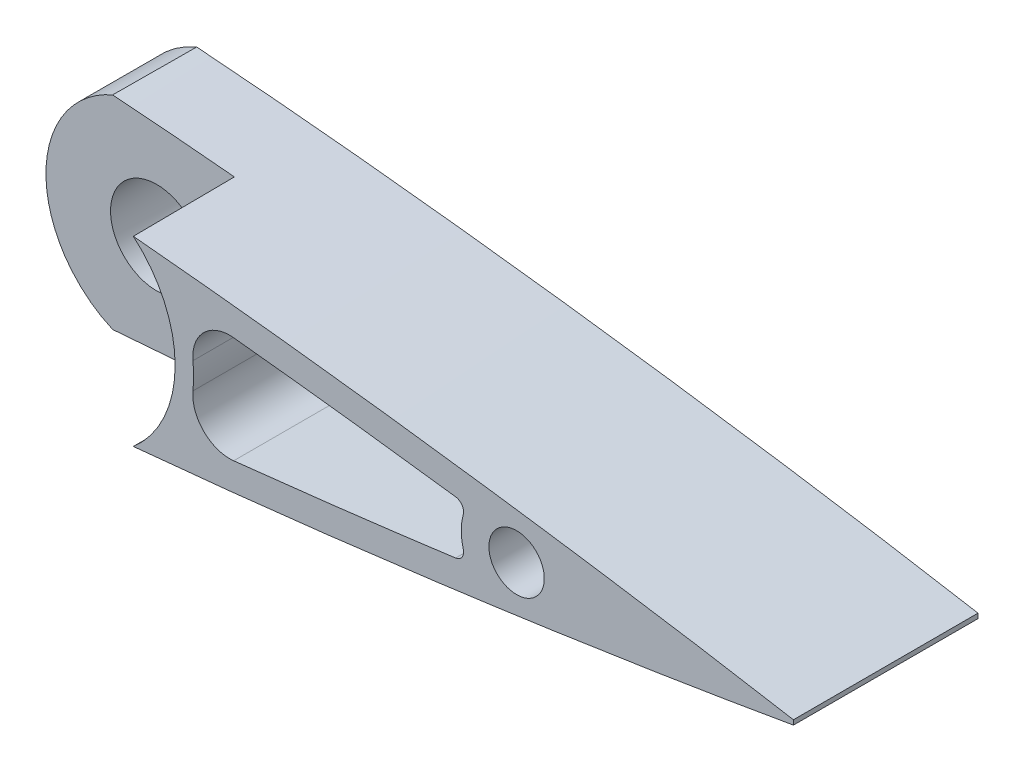
ISO-10303-21;
HEADER;
FILE_DESCRIPTION(('STEP AP214'),'2;1');
FILE_NAME('part.step','',(''),(''),'','','');
FILE_SCHEMA(('AUTOMOTIVE_DESIGN { 1 0 10303 214 1 1 1 1 }'));
ENDSEC;
DATA;
#1=APPLICATION_CONTEXT('core data for automotive mechanical design processes');
#2=APPLICATION_PROTOCOL_DEFINITION('international standard','automotive_design',2000,#1);
#3=PRODUCT_CONTEXT('',#1,'mechanical');
#4=PRODUCT('Part','Part','',(#3));
#5=PRODUCT_RELATED_PRODUCT_CATEGORY('part','',(#4));
#6=PRODUCT_DEFINITION_FORMATION('','',#4);
#7=PRODUCT_DEFINITION_CONTEXT('part definition',#1,'design');
#8=PRODUCT_DEFINITION('design','',#6,#7);
#9=PRODUCT_DEFINITION_SHAPE('','',#8);
#10=(LENGTH_UNIT() NAMED_UNIT(*) SI_UNIT(.MILLI.,.METRE.));
#11=(NAMED_UNIT(*) PLANE_ANGLE_UNIT() SI_UNIT($,.RADIAN.));
#12=(NAMED_UNIT(*) SI_UNIT($,.STERADIAN.) SOLID_ANGLE_UNIT());
#13=UNCERTAINTY_MEASURE_WITH_UNIT(LENGTH_MEASURE(1.E-05),#10,'distance_accuracy_value','');
#14=(GEOMETRIC_REPRESENTATION_CONTEXT(3) GLOBAL_UNCERTAINTY_ASSIGNED_CONTEXT((#13)) GLOBAL_UNIT_ASSIGNED_CONTEXT((#10,
#11,#12)) REPRESENTATION_CONTEXT('',''));
#15=CARTESIAN_POINT('',(0.,0.,0.));
#16=DIRECTION('',(0.,0.,1.));
#17=DIRECTION('',(1.,0.,0.));
#18=AXIS2_PLACEMENT_3D('',#15,#16,#17);
#19=CARTESIAN_POINT('',(-20.1616813694887,3.31023504071059,10.));
#20=DIRECTION('',(0.,0.,-1.));
#21=DIRECTION('',(-1.,0.,0.));
#22=AXIS2_PLACEMENT_3D('',#19,#20,#21);
#23=PLANE('',#22);
#24=CARTESIAN_POINT('',(-13.9999999999921,0.,10.));
#25=DIRECTION('',(0.,0.,-1.));
#26=DIRECTION('',(-1.,0.,0.));
#27=AXIS2_PLACEMENT_3D('',#24,#25,#26);
#28=CIRCLE('',#27,1.5);
#29=CARTESIAN_POINT('',(-15.4999999999921,0.,10.));
#30=VERTEX_POINT('',#29);
#31=EDGE_CURVE('E190',#30,#30,#28,.T.);
#32=ORIENTED_EDGE('',*,*,#31,.T.);
#33=EDGE_LOOP('',(#32));
#34=FACE_BOUND('',#33,.T.);
#35=CARTESIAN_POINT('',(1.00000000000793,0.126400000021113,10.));
#36=CARTESIAN_POINT('',(-0.332891696686789,0.355712039154586,10.));
#37=CARTESIAN_POINT('',(-2.99661901928217,0.813982388917145,10.));
#38=CARTESIAN_POINT('',(-8.327197733299,1.66593993688428,10.));
#39=CARTESIAN_POINT('',(-14.9909196420057,2.64398838429689,10.));
#40=CARTESIAN_POINT('',(-22.9915895506512,3.68598274015582,10.));
#41=CARTESIAN_POINT('',(-30.9914842782335,4.5898463473238,10.));
#42=CARTESIAN_POINT('',(-37.1462911810885,5.15820536435808,10.));
#43=CARTESIAN_POINT('',(-40.6336616034369,5.41921442571476,10.));
#44=CARTESIAN_POINT('',(-41.4508911473086,5.47659863273222,10.));
#45=B_SPLINE_CURVE_WITH_KNOTS('',3,(#35,#36,#37,#38,#39,#40,#41,#42,#43,#44),.UNSPECIFIED.,.F.,
.F.,(4,1,1,1,1,1,1,4),(0.,0.0246840231451877,0.0493299696040297,0.0985220811790582,
0.147602022491555,0.19657827575849,0.245450479952564,0.260402101301965),.UNSPECIFIED.);
#46=CARTESIAN_POINT('',(1.00000000000794,0.126400000021113,10.));
#47=VERTEX_POINT('',#46);
#48=CARTESIAN_POINT('',(-34.7639333281728,4.93008510594232,10.));
#49=VERTEX_POINT('',#48);
#50=EDGE_CURVE('E196',#47,#49,#45,.T.);
#51=ORIENTED_EDGE('',*,*,#50,.T.);
#52=CARTESIAN_POINT('',(-39.,0.,10.));
#53=DIRECTION('',(0.,0.,1.));
#54=DIRECTION('',(1.,0.,0.));
#55=AXIS2_PLACEMENT_3D('',#52,#53,#54);
#56=CIRCLE('',#55,6.5);
#57=CARTESIAN_POINT('',(-34.7655346404154,-4.93146054617468,10.));
#58=VERTEX_POINT('',#57);
#59=EDGE_CURVE('E177',#58,#49,#56,.T.);
#60=ORIENTED_EDGE('',*,*,#59,.F.);
#61=CARTESIAN_POINT('',(-41.4508911473972,-5.47659863269256,10.));
#62=CARTESIAN_POINT('',(-40.6336616034967,-5.41921442567341,10.));
#63=CARTESIAN_POINT('',(-37.1462911811193,-5.15820536431537,10.));
#64=CARTESIAN_POINT('',(-30.9914842782352,-4.58984634727895,10.));
#65=CARTESIAN_POINT('',(-22.9915895506525,-3.68598274011163,10.));
#66=CARTESIAN_POINT('',(-14.9909196420066,-2.64398838425336,10.));
#67=CARTESIAN_POINT('',(-8.3271977332995,-1.6659399368413,10.));
#68=CARTESIAN_POINT('',(-2.99661901928235,-0.813982388874595,10.));
#69=CARTESIAN_POINT('',(-0.332891696686836,-0.355712039112252,10.));
#70=CARTESIAN_POINT('',(1.00000000000794,-0.126399999978887,10.));
#71=B_SPLINE_CURVE_WITH_KNOTS('',3,(#61,#62,#63,#64,#65,#66,#67,#68,#69,#70),.UNSPECIFIED.,.F.,
.F.,(4,1,1,1,1,1,1,4),(0.739597898697507,0.754549520047436,0.803421724241509,0.852397977508445,
0.901477918820942,0.95067003039597,0.975315976854812,1.),.UNSPECIFIED.);
#72=CARTESIAN_POINT('',(1.00000000000794,-0.126399999978887,10.));
#73=VERTEX_POINT('',#72);
#74=EDGE_CURVE('E210',#58,#73,#71,.T.);
#75=ORIENTED_EDGE('',*,*,#74,.T.);
#76=DIRECTION('',(0.,1.,0.));
#77=VECTOR('',#76,1.);
#78=CARTESIAN_POINT('',(1.00000000000794,0.126400000021113,10.));
#79=LINE('',#78,#77);
#80=EDGE_CURVE('E207',#73,#47,#79,.T.);
#81=ORIENTED_EDGE('',*,*,#80,.T.);
#82=EDGE_LOOP('',(#51,#60,#75,#81));
#83=FACE_BOUND('',#82,.T.);
#84=CARTESIAN_POINT('',(-13.9999999999921,0.,10.));
#85=DIRECTION('',(0.,0.,-1.));
#86=DIRECTION('',(1.,0.,0.));
#87=AXIS2_PLACEMENT_3D('',#84,#85,#86);
#88=CIRCLE('',#87,3.);
#89=CARTESIAN_POINT('',(-16.88956392605,-0.806486402380637,10.));
#90=VERTEX_POINT('',#89);
#91=CARTESIAN_POINT('',(-16.88956392605,0.806486402380633,10.));
#92=VERTEX_POINT('',#91);
#93=EDGE_CURVE('E735',#90,#92,#88,.T.);
#94=ORIENTED_EDGE('',*,*,#93,.F.);
#95=CARTESIAN_POINT('',(-17.3711579137263,-0.940900802777427,10.));
#96=DIRECTION('',(0.,0.,-1.));
#97=DIRECTION('',(-1.,0.,0.));
#98=AXIS2_PLACEMENT_3D('',#95,#96,#97);
#99=CIRCLE('',#98,0.5);
#100=CARTESIAN_POINT('',(-17.3050759698461,-1.43652096874807,10.));
#101=VERTEX_POINT('',#100);
#102=EDGE_CURVE('E713',#90,#101,#99,.T.);
#103=ORIENTED_EDGE('',*,*,#102,.T.);
#104=CARTESIAN_POINT('',(-32.2099585068787,-3.18517448842145,10.));
#105=CARTESIAN_POINT('',(-29.5560787711105,-2.91962524442903,10.));
#106=CARTESIAN_POINT('',(-24.3737240987656,-2.34832760850158,10.));
#107=CARTESIAN_POINT('',(-19.2014926387051,-1.69222075085206,10.));
#108=CARTESIAN_POINT('',(-16.6778353356393,-1.35247843426761,10.));
#109=B_SPLINE_CURVE_WITH_KNOTS('',3,(#104,#105,#106,#107,#108),.UNSPECIFIED.,.F.,.F.,(4,1,4),
(0.101455102191136,0.149789154509261,0.19593607480968),.UNSPECIFIED.);
#110=CARTESIAN_POINT('',(-29.3293369032618,-2.88664529126532,10.));
#111=VERTEX_POINT('',#110);
#112=EDGE_CURVE('E325',#101,#111,#109,.F.);
#113=ORIENTED_EDGE('',*,*,#112,.T.);
#114=CARTESIAN_POINT('',(-29.5425320517707,-0.897942096248341,10.));
#115=DIRECTION('',(0.,0.,-1.));
#116=DIRECTION('',(-1.,0.,0.));
#117=AXIS2_PLACEMENT_3D('',#114,#115,#116);
#118=CIRCLE('',#117,2.);
#119=CARTESIAN_POINT('',(-31.5335779356084,-0.708901654932902,10.));
#120=VERTEX_POINT('',#119);
#121=EDGE_CURVE('E790',#111,#120,#118,.T.);
#122=ORIENTED_EDGE('',*,*,#121,.T.);
#123=CARTESIAN_POINT('',(-39.,0.,10.));
#124=DIRECTION('',(0.,0.,-1.));
#125=DIRECTION('',(1.,0.,0.));
#126=AXIS2_PLACEMENT_3D('',#123,#124,#125);
#127=CIRCLE('',#126,7.50000000000001);
#128=CARTESIAN_POINT('',(-31.5335779356084,0.708901654932895,10.));
#129=VERTEX_POINT('',#128);
#130=EDGE_CURVE('E745',#129,#120,#127,.T.);
#131=ORIENTED_EDGE('',*,*,#130,.F.);
#132=CARTESIAN_POINT('',(-29.5425320517707,0.897942096248334,10.));
#133=DIRECTION('',(0.,0.,-1.));
#134=DIRECTION('',(-1.,0.,0.));
#135=AXIS2_PLACEMENT_3D('',#132,#133,#134);
#136=CIRCLE('',#135,2.);
#137=CARTESIAN_POINT('',(-29.3293369032618,2.88664529126531,10.));
#138=VERTEX_POINT('',#137);
#139=EDGE_CURVE('E796',#129,#138,#136,.T.);
#140=ORIENTED_EDGE('',*,*,#139,.T.);
#141=CARTESIAN_POINT('',(-16.6778353356393,1.3524784342676,10.));
#142=CARTESIAN_POINT('',(-19.2014926387051,1.69222075085206,10.));
#143=CARTESIAN_POINT('',(-24.3737240987656,2.34832760850158,10.));
#144=CARTESIAN_POINT('',(-29.5560787711105,2.91962524442903,10.));
#145=CARTESIAN_POINT('',(-32.2099585068787,3.18517448842144,10.));
#146=B_SPLINE_CURVE_WITH_KNOTS('',3,(#141,#142,#143,#144,#145),.UNSPECIFIED.,.F.,.F.,(4,1,4),
(0.101455102191136,0.147602022491555,0.19593607480968),.UNSPECIFIED.);
#147=CARTESIAN_POINT('',(-17.3050759698461,1.43652096874806,10.));
#148=VERTEX_POINT('',#147);
#149=EDGE_CURVE('E76',#138,#148,#146,.F.);
#150=ORIENTED_EDGE('',*,*,#149,.T.);
#151=CARTESIAN_POINT('',(-17.3711579137263,0.940900802777413,10.));
#152=DIRECTION('',(0.,0.,-1.));
#153=DIRECTION('',(-1.,0.,0.));
#154=AXIS2_PLACEMENT_3D('',#151,#152,#153);
#155=CIRCLE('',#154,0.5);
#156=EDGE_CURVE('E83',#148,#92,#155,.T.);
#157=ORIENTED_EDGE('',*,*,#156,.T.);
#158=EDGE_LOOP('',(#94,#103,#113,#122,#131,#140,#150,#157));
#159=FACE_BOUND('',#158,.T.);
#160=ADVANCED_FACE('F72',(#34,#83,#159),#23,.F.);
#161=CARTESIAN_POINT('',(-20.1040636280253,-3.31773607408956,0.));
#162=DIRECTION('',(0.,0.,-1.));
#163=DIRECTION('',(-1.,0.,0.));
#164=AXIS2_PLACEMENT_3D('',#161,#162,#163);
#165=PLANE('',#164);
#166=CARTESIAN_POINT('',(-39.,0.,0.));
#167=DIRECTION('',(0.,0.,-1.));
#168=DIRECTION('',(-1.,0.,0.));
#169=AXIS2_PLACEMENT_3D('',#166,#167,#168);
#170=CIRCLE('',#169,2.5);
#171=CARTESIAN_POINT('',(-41.5,0.,0.));
#172=VERTEX_POINT('',#171);
#173=EDGE_CURVE('E318',#172,#172,#170,.T.);
#174=ORIENTED_EDGE('',*,*,#173,.F.);
#175=EDGE_LOOP('',(#174));
#176=FACE_BOUND('',#175,.T.);
#177=CARTESIAN_POINT('',(-41.3322887287214,-5.52814881184286,0.));
#178=CARTESIAN_POINT('',(-40.888115435542,-5.49508238364858,0.));
#179=CARTESIAN_POINT('',(-37.707276361854,-5.25089961621523,0.));
#180=CARTESIAN_POINT('',(-31.7912713851926,-4.70459250594914,0.));
#181=CARTESIAN_POINT('',(-23.5913792894218,-3.77813230859318,0.));
#182=CARTESIAN_POINT('',(-15.3906926330612,-2.710088093829,0.));
#183=CARTESIAN_POINT('',(-8.56037767663792,-1.70758843522376,0.));
#184=CARTESIAN_POINT('',(-3.09653449477157,-0.834331948551595,0.));
#185=CARTESIAN_POINT('',(-0.366213989111814,-0.364604840042049,0.));
#186=CARTESIAN_POINT('',(1.,-0.129559999928777,0.));
#187=B_SPLINE_CURVE_WITH_KNOTS('',3,(#177,#178,#179,#180,#181,#182,#183,#184,#185,#186),
.UNSPECIFIED.,.F.,.F.,(4,1,1,1,1,1,1,4),(0.746618933878264,0.754549520047436,0.803421724241509,
0.852397977508445,0.901477918820942,0.95067003039597,0.975315976854812,1.),.UNSPECIFIED.);
#188=CARTESIAN_POINT('',(-41.3322887287213,-5.52814881184285,0.));
#189=VERTEX_POINT('',#188);
#190=CARTESIAN_POINT('',(1.,-0.129559999928777,0.));
#191=VERTEX_POINT('',#190);
#192=EDGE_CURVE('E465',#189,#191,#187,.T.);
#193=ORIENTED_EDGE('',*,*,#192,.F.);
#194=CARTESIAN_POINT('',(-39.,0.,0.));
#195=DIRECTION('',(0.,0.,1.));
#196=DIRECTION('',(1.,0.,0.));
#197=AXIS2_PLACEMENT_3D('',#194,#195,#196);
#198=CIRCLE('',#197,6.);
#199=CARTESIAN_POINT('',(-41.3322887286357,5.52814881187897,0.));
#200=VERTEX_POINT('',#199);
#201=EDGE_CURVE('E454',#200,#189,#198,.T.);
#202=ORIENTED_EDGE('',*,*,#201,.F.);
#203=CARTESIAN_POINT('',(1.,0.129559999928778,0.));
#204=CARTESIAN_POINT('',(-0.366213989111605,0.364604840043409,0.));
#205=CARTESIAN_POINT('',(-3.0965344947709,0.83433194855567,0.));
#206=CARTESIAN_POINT('',(-8.56037767663634,1.70758843523326,0.));
#207=CARTESIAN_POINT('',(-15.3906926330586,2.7100880938453,0.));
#208=CARTESIAN_POINT('',(-23.5913792894181,3.77813230861763,0.));
#209=CARTESIAN_POINT('',(-31.791271385188,4.70459250598175,0.));
#210=CARTESIAN_POINT('',(-37.7072763618221,5.25089961625125,0.));
#211=CARTESIAN_POINT('',(-40.8881154354831,5.49508238368612,0.));
#212=CARTESIAN_POINT('',(-41.3322887286357,5.52814881187897,0.));
#213=B_SPLINE_CURVE_WITH_KNOTS('',3,(#203,#204,#205,#206,#207,#208,#209,#210,#211,#212),
.UNSPECIFIED.,.F.,.F.,(4,1,1,1,1,1,1,4),(0.,0.0246840231451877,0.0493299696040297,
0.0985220811790582,0.147602022491555,0.19657827575849,0.245450479952564,0.253381066121258),.UNSPECIFIED.);
#214=CARTESIAN_POINT('',(1.,0.129559999928778,0.));
#215=VERTEX_POINT('',#214);
#216=EDGE_CURVE('E457',#215,#200,#213,.T.);
#217=ORIENTED_EDGE('',*,*,#216,.F.);
#218=DIRECTION('',(0.,1.,0.));
#219=VECTOR('',#218,1.);
#220=CARTESIAN_POINT('',(1.,0.129559999928777,0.));
#221=LINE('',#220,#219);
#222=EDGE_CURVE('E461',#191,#215,#221,.T.);
#223=ORIENTED_EDGE('',*,*,#222,.F.);
#224=EDGE_LOOP('',(#193,#202,#217,#223));
#225=FACE_BOUND('',#224,.T.);
#226=CARTESIAN_POINT('',(-13.9999999999921,0.,0.));
#227=DIRECTION('',(0.,0.,-1.));
#228=DIRECTION('',(-1.,0.,0.));
#229=AXIS2_PLACEMENT_3D('',#226,#227,#228);
#230=CIRCLE('',#229,1.5);
#231=CARTESIAN_POINT('',(-15.4999999999921,0.,0.));
#232=VERTEX_POINT('',#231);
#233=EDGE_CURVE('E772',#232,#232,#230,.T.);
#234=ORIENTED_EDGE('',*,*,#233,.F.);
#235=EDGE_LOOP('',(#234));
#236=FACE_BOUND('',#235,.T.);
#237=CARTESIAN_POINT('',(-32.2099585068787,-3.18517448842145,0.));
#238=CARTESIAN_POINT('',(-29.5560787711105,-2.91962524442903,0.));
#239=CARTESIAN_POINT('',(-24.3737240987656,-2.34832760850158,0.));
#240=CARTESIAN_POINT('',(-19.2014926387051,-1.69222075085206,0.));
#241=CARTESIAN_POINT('',(-16.6778353356393,-1.35247843426761,0.));
#242=B_SPLINE_CURVE_WITH_KNOTS('',3,(#237,#238,#239,#240,#241),.UNSPECIFIED.,.F.,.F.,(4,1,4),
(0.101455102191136,0.149789154509261,0.19593607480968),.UNSPECIFIED.);
#243=CARTESIAN_POINT('',(-17.3050767860409,-1.4365148507662,0.));
#244=VERTEX_POINT('',#243);
#245=CARTESIAN_POINT('',(-29.3293473415579,-2.88654770806068,0.));
#246=VERTEX_POINT('',#245);
#247=EDGE_CURVE('E767',#244,#246,#242,.F.);
#248=ORIENTED_EDGE('',*,*,#247,.F.);
#249=CARTESIAN_POINT('',(-17.3711579137263,-0.940900802777427,0.));
#250=DIRECTION('',(0.,0.,-1.));
#251=DIRECTION('',(-1.,0.,0.));
#252=AXIS2_PLACEMENT_3D('',#249,#250,#251);
#253=CIRCLE('',#252,0.5);
#254=CARTESIAN_POINT('',(-16.88956392605,-0.806486402380637,0.));
#255=VERTEX_POINT('',#254);
#256=EDGE_CURVE('E718',#244,#255,#253,.F.);
#257=ORIENTED_EDGE('',*,*,#256,.T.);
#258=CARTESIAN_POINT('',(-13.9999999999921,0.,0.));
#259=DIRECTION('',(0.,0.,-1.));
#260=DIRECTION('',(-1.,0.,0.));
#261=AXIS2_PLACEMENT_3D('',#258,#259,#260);
#262=CIRCLE('',#261,3.);
#263=CARTESIAN_POINT('',(-16.88956392605,0.806486402380633,0.));
#264=VERTEX_POINT('',#263);
#265=EDGE_CURVE('E202',#264,#255,#262,.F.);
#266=ORIENTED_EDGE('',*,*,#265,.F.);
#267=CARTESIAN_POINT('',(-17.3711579137263,0.940900802777413,0.));
#268=DIRECTION('',(0.,0.,-1.));
#269=DIRECTION('',(-1.,0.,0.));
#270=AXIS2_PLACEMENT_3D('',#267,#268,#269);
#271=CIRCLE('',#270,0.5);
#272=CARTESIAN_POINT('',(-17.3050767860409,1.43651485076619,0.));
#273=VERTEX_POINT('',#272);
#274=EDGE_CURVE('E12',#264,#273,#271,.F.);
#275=ORIENTED_EDGE('',*,*,#274,.T.);
#276=CARTESIAN_POINT('',(-16.6778353356393,1.3524784342676,0.));
#277=CARTESIAN_POINT('',(-19.2014926387051,1.69222075085206,0.));
#278=CARTESIAN_POINT('',(-24.3737240987656,2.34832760850158,0.));
#279=CARTESIAN_POINT('',(-29.5560787711105,2.91962524442903,0.));
#280=CARTESIAN_POINT('',(-32.2099585068787,3.18517448842144,0.));
#281=B_SPLINE_CURVE_WITH_KNOTS('',3,(#276,#277,#278,#279,#280),.UNSPECIFIED.,.F.,.F.,(4,1,4),
(0.101455102191136,0.147602022491555,0.19593607480968),.UNSPECIFIED.);
#282=CARTESIAN_POINT('',(-29.3293473415579,2.88654770806067,0.));
#283=VERTEX_POINT('',#282);
#284=EDGE_CURVE('E809',#283,#273,#281,.F.);
#285=ORIENTED_EDGE('',*,*,#284,.F.);
#286=CARTESIAN_POINT('',(-29.5425320517707,0.897942096248334,0.));
#287=DIRECTION('',(0.,0.,-1.));
#288=DIRECTION('',(-1.,0.,0.));
#289=AXIS2_PLACEMENT_3D('',#286,#287,#288);
#290=CIRCLE('',#289,2.);
#291=CARTESIAN_POINT('',(-31.5335779356084,0.708901654932895,0.));
#292=VERTEX_POINT('',#291);
#293=EDGE_CURVE('E748',#283,#292,#290,.F.);
#294=ORIENTED_EDGE('',*,*,#293,.T.);
#295=CARTESIAN_POINT('',(-39.,0.,0.));
#296=DIRECTION('',(0.,0.,-1.));
#297=DIRECTION('',(-1.,0.,0.));
#298=AXIS2_PLACEMENT_3D('',#295,#296,#297);
#299=CIRCLE('',#298,7.50000000000001);
#300=CARTESIAN_POINT('',(-31.5335779356084,-0.708901654932902,0.));
#301=VERTEX_POINT('',#300);
#302=EDGE_CURVE('E807',#301,#292,#299,.F.);
#303=ORIENTED_EDGE('',*,*,#302,.F.);
#304=CARTESIAN_POINT('',(-29.5425320517707,-0.897942096248341,0.));
#305=DIRECTION('',(0.,0.,-1.));
#306=DIRECTION('',(-1.,0.,0.));
#307=AXIS2_PLACEMENT_3D('',#304,#305,#306);
#308=CIRCLE('',#307,2.);
#309=EDGE_CURVE('E792',#301,#246,#308,.F.);
#310=ORIENTED_EDGE('',*,*,#309,.T.);
#311=EDGE_LOOP('',(#248,#257,#266,#275,#285,#294,#303,#310));
#312=FACE_BOUND('',#311,.T.);
#313=ADVANCED_FACE('F234',(#176,#225,#236,#312),#165,.T.);
#314=CARTESIAN_POINT('',(-41.3322887286357,5.52814881187897,0.));
#315=CARTESIAN_POINT('',(-41.4508911473086,5.47659863273223,10.));
#316=CARTESIAN_POINT('',(-47.0634917525486,3.11019287960161,0.));
#317=CARTESIAN_POINT('',(-46.9533185070077,3.01414859595334,10.));
#318=CARTESIAN_POINT('',(-47.0634917525968,-3.11019287947669,0.));
#319=CARTESIAN_POINT('',(-46.9533185070564,-3.01414859582458,10.));
#320=CARTESIAN_POINT('',(-41.3322887287213,-5.52814881184285,0.));
#321=CARTESIAN_POINT('',(-41.4508911473972,-5.47659863269255,10.));
#322=(BOUNDED_SURFACE() B_SPLINE_SURFACE(3,1,((#314,#315),(#316,#317),(#318,#319),(#320,#321)),
.UNSPECIFIED.,.F.,.F.,.F.) B_SPLINE_SURFACE_WITH_KNOTS((4,4),(2,2),(0.,1.),(0.,1.),
.UNSPECIFIED.) GEOMETRIC_REPRESENTATION_ITEM() RATIONAL_B_SPLINE_SURFACE(((1.,1.),
(0.592476525408722,0.605654571928095),(0.592476525408722,0.605654571928095),(1.,1.))) REPRESENTATION_ITEM('') SURFACE());
#323=DIRECTION('',(-0.0118592502412293,0.00515458690765997,0.999916390713507));
#324=VECTOR('',#323,1.);
#325=CARTESIAN_POINT('',(-41.3915899380593,-5.5023737222677,5.));
#326=LINE('',#325,#324);
#327=CARTESIAN_POINT('',(-41.3856598171255,-5.50495123122522,4.5));
#328=VERTEX_POINT('',#327);
#329=EDGE_CURVE('E448',#189,#328,#326,.T.);
#330=CARTESIAN_POINT('',(-41.3856598171255,-5.50495123122522,4.5));
#331=CARTESIAN_POINT('',(-41.5405062395462,-5.43787498188726,4.5));
#332=CARTESIAN_POINT('',(-41.6925057816997,-5.36423511735281,4.5));
#333=CARTESIAN_POINT('',(-41.9897602411455,-5.20442607883088,4.5));
#334=CARTESIAN_POINT('',(-42.1350154789359,-5.11825750102993,4.5));
#335=CARTESIAN_POINT('',(-42.4176453596703,-4.93404766295152,4.5));
#336=CARTESIAN_POINT('',(-42.5550255065476,-4.83601484748093,4.5));
#337=CARTESIAN_POINT('',(-42.821041353434,-4.62873072130511,4.5));
#338=CARTESIAN_POINT('',(-42.9496771604329,-4.5194795479012,4.5));
#339=CARTESIAN_POINT('',(-43.1973271058043,-4.29049932141707,4.5));
#340=CARTESIAN_POINT('',(-43.3163384609139,-4.17076725810136,4.5));
#341=CARTESIAN_POINT('',(-43.5438943452475,-3.92165744482849,4.5));
#342=CARTESIAN_POINT('',(-43.6524349911009,-3.79227614747234,4.5));
#343=CARTESIAN_POINT('',(-43.8581695797561,-3.52490192663948,4.5));
#344=CARTESIAN_POINT('',(-43.9553698358015,-3.38691386088693,4.5));
#345=CARTESIAN_POINT('',(-44.1378367346743,-3.10318893747077,4.5));
#346=CARTESIAN_POINT('',(-44.2230989598603,-2.95744923871613,4.5));
#347=CARTESIAN_POINT('',(-44.381009892173,-2.65936227967569,4.5));
#348=CARTESIAN_POINT('',(-44.4536634955933,-2.50701761314371,4.5));
#349=CARTESIAN_POINT('',(-44.5859057594675,-2.19669291090409,4.5));
#350=CARTESIAN_POINT('',(-44.6454895823698,-2.03871081367,4.5));
#351=CARTESIAN_POINT('',(-44.7511216245107,-1.71832628110383,4.5));
#352=CARTESIAN_POINT('',(-44.7971730647711,-1.55592490773391,4.5));
#353=CARTESIAN_POINT('',(-44.875446578234,-1.22775859109118,4.5));
#354=CARTESIAN_POINT('',(-44.9076634683686,-1.06199241152029,4.5));
#355=CARTESIAN_POINT('',(-44.9580002138835,-0.728423239633898,4.5));
#356=CARTESIAN_POINT('',(-44.9761275245402,-0.560621372275508,4.5));
#357=CARTESIAN_POINT('',(-44.9981895110299,-0.224010755767521,4.5));
#358=CARTESIAN_POINT('',(-45.0021177523013,-0.0552015848399874,4.5));
#359=CARTESIAN_POINT('',(-44.9957357903382,0.282145070019497,4.5));
#360=CARTESIAN_POINT('',(-44.9854257827677,0.450682557653096,4.5));
#361=CARTESIAN_POINT('',(-44.9506489488494,0.78621329822176,4.5));
#362=CARTESIAN_POINT('',(-44.9261885368028,0.953207216025906,4.5));
#363=CARTESIAN_POINT('',(-44.863275959059,1.28461402714459,4.5));
#364=CARTESIAN_POINT('',(-44.8248176854995,1.4490257610244,4.5));
#365=CARTESIAN_POINT('',(-44.734201551831,1.77396314581935,4.5));
#366=CARTESIAN_POINT('',(-44.682048822811,1.93449022769812,4.5));
#367=CARTESIAN_POINT('',(-44.564390353373,2.25062826306484,4.5));
#368=CARTESIAN_POINT('',(-44.4988806528762,2.40623774274103,4.5));
#369=CARTESIAN_POINT('',(-44.3550104241708,2.71132768832456,4.5));
#370=CARTESIAN_POINT('',(-44.2766546518296,2.86081039697758,4.5));
#371=CARTESIAN_POINT('',(-44.1075950923326,3.15270968533071,4.5));
#372=CARTESIAN_POINT('',(-44.0168859051842,3.29512313752401,4.5));
#373=CARTESIAN_POINT('',(-43.823826613512,3.57174975912439,4.5));
#374=CARTESIAN_POINT('',(-43.7214808395129,3.70596595072209,4.5));
#375=CARTESIAN_POINT('',(-43.5058095294444,3.96534957851464,4.5));
#376=CARTESIAN_POINT('',(-43.3924798880196,4.09051360059086,4.5));
#377=CARTESIAN_POINT('',(-43.1557226535891,4.33080188008507,4.5));
#378=CARTESIAN_POINT('',(-43.0322992277106,4.44593024048551,4.5));
#379=CARTESIAN_POINT('',(-42.7904840227222,4.65314186576352,4.5));
#380=CARTESIAN_POINT('',(-42.6730649762582,4.74636343240064,4.5));
#381=CARTESIAN_POINT('',(-42.4315869345712,4.92375316697099,4.5));
#382=CARTESIAN_POINT('',(-42.3075285038137,5.00792210271334,4.5));
#383=CARTESIAN_POINT('',(-42.053489188469,5.16671885843,4.5));
#384=CARTESIAN_POINT('',(-41.9235096577069,5.24134884472531,4.5));
#385=CARTESIAN_POINT('',(-41.6583206603641,5.38069249136314,4.5));
#386=CARTESIAN_POINT('',(-41.5231105884681,5.44540499965922,4.5));
#387=CARTESIAN_POINT('',(-41.3856598170385,5.50495123126294,4.5));
#388=B_SPLINE_CURVE_WITH_KNOTS('',3,(#330,#331,#332,#333,#334,#335,#336,#337,#338,#339,#340,
#341,#342,#343,#344,#345,#346,#347,#348,#349,#350,#351,#352,#353,#354,#355,#356,#357,#358,#359,
#360,#361,#362,#363,#364,#365,#366,#367,#368,#369,#370,#371,#372,#373,#374,#375,#376,#377,#378,
#379,#380,#381,#382,#383,#384,#385,#386,#387),.UNSPECIFIED.,.F.,.F.,(4,2,2,2,2,2,2,2,2,2,2,2,2,
2,2,2,2,2,2,2,2,2,2,2,2,2,2,2,4),(0.,0.506096189949713,1.01216830487761,1.51788229987365,
2.02359010618169,2.52944363732336,3.03548406360438,3.54124141702955,4.04718543297496,
4.55293253440214,5.05886651462178,5.56467997305918,6.07068276783044,6.57641763667089,
7.08238165957517,7.58833872951503,8.0940666313821,8.60001546890665,9.10577500548959,
9.61168470842138,10.1174075348791,10.6233521395147,11.1291090707262,11.6350557691965,
12.1407946365049,12.5901586794401,13.0394845789498,13.4887082533449,13.9379840715311),.UNSPECIFIED.);
#389=CARTESIAN_POINT('',(-41.3856598170385,5.50495123126294,4.5));
#390=VERTEX_POINT('',#389);
#391=EDGE_CURVE('E340',#328,#390,#388,.T.);
#392=DIRECTION('',(0.0118592502409283,0.00515458690730476,-0.999916390713513));
#393=VECTOR('',#392,1.);
#394=CARTESIAN_POINT('',(-41.3915899379721,5.5023737223056,5.));
#395=LINE('',#394,#393);
#396=EDGE_CURVE('E222',#390,#200,#395,.T.);
#397=ORIENTED_EDGE('',*,*,#329,.T.);
#398=ORIENTED_EDGE('',*,*,#391,.T.);
#399=ORIENTED_EDGE('',*,*,#396,.T.);
#400=ORIENTED_EDGE('',*,*,#201,.T.);
#401=EDGE_LOOP('',(#397,#398,#399,#400));
#402=FACE_BOUND('',#401,.T.);
#403=ADVANCED_FACE('F359',(#402),#322,.T.);
#404=CARTESIAN_POINT('',(-41.3322887287214,-5.52814881184286,0.));
#405=CARTESIAN_POINT('',(-41.4508911473972,-5.47659863269256,10.));
#406=CARTESIAN_POINT('',(-36.6778346249443,-5.18164852745052,0.));
#407=CARTESIAN_POINT('',(-36.7827116720474,-5.14880850393939,10.));
#408=CARTESIAN_POINT('',(-31.7751636716461,-4.70155107623405,0.));
#409=CARTESIAN_POINT('',(-31.8657923654742,-4.67997713279219,10.));
#410=CARTESIAN_POINT('',(-17.6366163862359,-3.0872229797556,0.));
#411=CARTESIAN_POINT('',(-17.6869807398761,-3.08469399076853,10.));
#412=CARTESIAN_POINT('',(-8.17036963816386,-1.70723969180713,0.));
#413=CARTESIAN_POINT('',(-8.1946146280897,-1.70825082450042,10.));
#414=CARTESIAN_POINT('',(1.,-0.129559999928777,0.));
#415=CARTESIAN_POINT('',(1.00000000000794,-0.126399999978887,10.));
#416=B_SPLINE_SURFACE_WITH_KNOTS('',3,1,((#404,#405),(#406,#407),(#408,#409),(#410,#411),(#412,
#413),(#414,#415)),.UNSPECIFIED.,.F.,.F.,.F.,(4,1,1,4),(2,2),(0.,0.327986311391135,
0.346105681108685,1.),(0.,1.),.UNSPECIFIED.);
#417=CARTESIAN_POINT('',(-34.7938910980119,-4.95566826014574,4.5));
#418=CARTESIAN_POINT('',(-34.7891196373861,-4.95161827325495,5.41666626252102));
#419=CARTESIAN_POINT('',(-34.7843765416857,-4.94758084122368,6.33333272605814));
#420=CARTESIAN_POINT('',(-34.7749470801138,-4.93953108686163,8.16666605939147));
#421=CARTESIAN_POINT('',(-34.7702607142426,-4.93551876453096,9.08333292918769));
#422=CARTESIAN_POINT('',(-34.7656027132971,-4.93151899705992,10.));
#423=B_SPLINE_CURVE_WITH_KNOTS('',3,(#417,#418,#419,#420,#421,#422),.UNSPECIFIED.,.F.,.F.,(4,2,
4),(0.,2.75006287722497,5.50012576713095),.UNSPECIFIED.);
#424=CARTESIAN_POINT('',(-34.7938910980053,-4.95566826014016,4.5));
#425=VERTEX_POINT('',#424);
#426=EDGE_CURVE('E184',#425,#58,#423,.T.);
#427=CARTESIAN_POINT('',(-32.422,-4.72591409814278,4.5));
#428=CARTESIAN_POINT('',(-32.7950539709515,-4.76327401632709,4.5));
#429=CARTESIAN_POINT('',(-33.1681639419479,-4.80007613629807,4.5));
#430=CARTESIAN_POINT('',(-33.9144836616528,-4.87252267067212,4.5));
#431=CARTESIAN_POINT('',(-34.2876934066124,-4.90816712370276,4.5));
#432=CARTESIAN_POINT('',(-35.0342165504392,-4.97825788792766,4.5));
#433=CARTESIAN_POINT('',(-35.4075299466482,-5.01270422742031,4.5));
#434=CARTESIAN_POINT('',(-36.1542641716685,-5.08035827577652,4.5));
#435=CARTESIAN_POINT('',(-36.5276849990407,-5.11356600051894,4.5));
#436=CARTESIAN_POINT('',(-37.2746392897071,-5.17870240957101,4.5));
#437=CARTESIAN_POINT('',(-37.6481727533129,-5.21063109030895,4.5));
#438=CARTESIAN_POINT('',(-38.3953541716178,-5.27316865260781,4.5));
#439=CARTESIAN_POINT('',(-38.7690021274875,-5.30377752018769,4.5));
#440=CARTESIAN_POINT('',(-39.5164158133865,-5.36363478344048,4.5));
#441=CARTESIAN_POINT('',(-39.8901815459534,-5.39288314744763,4.5));
#442=CARTESIAN_POINT('',(-40.6378339485778,-5.44997868303516,4.5));
#443=CARTESIAN_POINT('',(-41.0117206226099,-5.47782580255594,4.5));
#444=CARTESIAN_POINT('',(-41.3856598171255,-5.50495123122523,4.5));
#445=B_SPLINE_CURVE_WITH_KNOTS('',3,(#427,#428,#429,#430,#431,#432,#433,#434,#435,#436,#437,
#438,#439,#440,#441,#442,#443,#444),.UNSPECIFIED.,.F.,.F.,(4,2,2,2,2,2,2,2,4),(0.,
1.12475987389919,2.24948217959061,3.3741779022521,4.49885920151595,5.6235436412167,
6.7482399919962,7.87296250702879,8.99772677740117),.UNSPECIFIED.);
#446=EDGE_CURVE('E338',#425,#328,#445,.T.);
#447=DIRECTION('',(7.94156367651545E-13,0.000315999979211717,0.999999950072005));
#448=VECTOR('',#447,1.);
#449=CARTESIAN_POINT('',(1.00000000000397,-0.127979999953832,5.));
#450=LINE('',#449,#448);
#451=EDGE_CURVE('E445',#191,#73,#450,.T.);
#452=ORIENTED_EDGE('',*,*,#426,.F.);
#453=ORIENTED_EDGE('',*,*,#446,.T.);
#454=ORIENTED_EDGE('',*,*,#329,.F.);
#455=ORIENTED_EDGE('',*,*,#192,.T.);
#456=ORIENTED_EDGE('',*,*,#451,.T.);
#457=ORIENTED_EDGE('',*,*,#74,.F.);
#458=EDGE_LOOP('',(#452,#453,#454,#455,#456,#457));
#459=FACE_BOUND('',#458,.T.);
#460=ADVANCED_FACE('F379',(#459),#416,.T.);
#461=CARTESIAN_POINT('',(1.,0.129559999928778,0.));
#462=CARTESIAN_POINT('',(1.00000000000793,0.126400000021113,10.));
#463=CARTESIAN_POINT('',(-7.09576359720545,1.52236337881115,0.));
#464=CARTESIAN_POINT('',(-7.11716750105345,1.52288572821052,10.));
#465=CARTESIAN_POINT('',(-15.2232490180789,2.73720132954669,0.));
#466=CARTESIAN_POINT('',(-15.2645667975963,2.74485692404815,10.));
#467=CARTESIAN_POINT('',(-26.4341610154364,4.10344840627585,0.));
#468=CARTESIAN_POINT('',(-26.5104863246127,4.08151031826366,10.));
#469=CARTESIAN_POINT('',(-32.4126473129648,4.77043982790211,0.));
#470=CARTESIAN_POINT('',(-32.5056684126726,4.74900960771035,10.));
#471=CARTESIAN_POINT('',(-38.4043688889342,5.31018016624796,0.));
#472=CARTESIAN_POINT('',(-38.5143369771291,5.2703997334349,10.));
#473=CARTESIAN_POINT('',(-41.3322887286357,5.52814881187897,0.));
#474=CARTESIAN_POINT('',(-41.4508911473086,5.47659863273222,10.));
#475=B_SPLINE_SURFACE_WITH_KNOTS('',3,1,((#461,#462),(#463,#464),(#465,#466),(#467,#468),(#469,
#470),(#471,#472),(#473,#474)),.UNSPECIFIED.,.F.,.F.,.F.,(4,2,1,4),(2,2),(0.,0.577269407240984,
0.793677716408478,1.),(0.,1.),.UNSPECIFIED.);
#476=CARTESIAN_POINT('',(-34.7623935882184,4.92876170034901,10.));
#477=CARTESIAN_POINT('',(-34.7671193123076,4.93282495492767,9.08333295068747));
#478=CARTESIAN_POINT('',(-34.7718722701104,4.93689948258912,8.16666609363887));
#479=CARTESIAN_POINT('',(-34.7814326531628,4.94507108409438,6.33333276030553));
#480=CARTESIAN_POINT('',(-34.7862400784127,4.94916815793827,5.4166662840208));
#481=CARTESIAN_POINT('',(-34.7910747373763,4.95327650486504,4.5));
#482=B_SPLINE_CURVE_WITH_KNOTS('',3,(#476,#477,#478,#479,#480,#481),.UNSPECIFIED.,.F.,.F.,(4,2,
4),(0.,2.75006470337593,5.5001294180441),.UNSPECIFIED.);
#483=CARTESIAN_POINT('',(-34.7910747373558,4.95327650486312,4.5));
#484=VERTEX_POINT('',#483);
#485=EDGE_CURVE('E181',#49,#484,#482,.T.);
#486=DIRECTION('',(7.93852791058407E-13,-0.000315999974989341,0.999999950072007));
#487=VECTOR('',#486,1.);
#488=CARTESIAN_POINT('',(1.,0.129559999928778,0.));
#489=LINE('',#488,#487);
#490=EDGE_CURVE('E211',#215,#47,#489,.T.);
#491=CARTESIAN_POINT('',(-41.3856598170385,5.50495123126294,4.5));
#492=CARTESIAN_POINT('',(-41.0117105407842,5.4778250751178,4.5));
#493=CARTESIAN_POINT('',(-40.6378166959438,5.44993833232019,4.5));
#494=CARTESIAN_POINT('',(-39.8901551060032,5.39270468799889,4.5));
#495=CARTESIAN_POINT('',(-39.5163873566318,5.36335784228998,4.5));
#496=CARTESIAN_POINT('',(-38.7689733133134,5.30326362370504,4.5));
#497=CARTESIAN_POINT('',(-38.3953270167452,5.27251628339894,4.5));
#498=CARTESIAN_POINT('',(-37.6481510496924,5.20968065945108,4.5));
#499=CARTESIAN_POINT('',(-37.2746213780699,5.17759238933217,4.5));
#500=CARTESIAN_POINT('',(-36.5276759280664,5.11213462484581,4.5));
#501=CARTESIAN_POINT('',(-36.1542601492251,5.07876513572864,4.5));
#502=CARTESIAN_POINT('',(-35.4075348340466,5.01080419060212,4.5));
#503=CARTESIAN_POINT('',(-35.0342252991956,4.97621271827281,4.5));
#504=CARTESIAN_POINT('',(-34.2877069078934,4.90586719668423,4.5));
#505=CARTESIAN_POINT('',(-33.9144980540488,4.8701131197856,4.5));
#506=CARTESIAN_POINT('',(-33.1681753256527,4.79750169168976,4.5));
#507=CARTESIAN_POINT('',(-32.7950614546104,4.76064430441408,4.5));
#508=CARTESIAN_POINT('',(-32.422,4.72326569588898,4.5));
#509=B_SPLINE_CURVE_WITH_KNOTS('',3,(#491,#492,#493,#494,#495,#496,#497,#498,#499,#500,#501,
#502,#503,#504,#505,#506,#507,#508),.UNSPECIFIED.,.F.,.F.,(4,2,2,2,2,2,2,2,4),(0.,
1.124794386875,2.24954580966516,3.37427108855157,4.49898502767093,5.62369435833217,
6.74841871550476,7.87316983105796,8.99795776647628),.UNSPECIFIED.);
#510=EDGE_CURVE('E200',#390,#484,#509,.T.);
#511=ORIENTED_EDGE('',*,*,#485,.F.);
#512=ORIENTED_EDGE('',*,*,#50,.F.);
#513=ORIENTED_EDGE('',*,*,#490,.F.);
#514=ORIENTED_EDGE('',*,*,#216,.T.);
#515=ORIENTED_EDGE('',*,*,#396,.F.);
#516=ORIENTED_EDGE('',*,*,#510,.T.);
#517=EDGE_LOOP('',(#511,#512,#513,#514,#515,#516));
#518=FACE_BOUND('',#517,.T.);
#519=ADVANCED_FACE('F194',(#518),#475,.T.);
#520=CARTESIAN_POINT('',(1.,0.,-7.93852830693889E-13));
#521=DIRECTION('',(-1.,0.,7.93852830693886E-13));
#522=DIRECTION('',(7.93852830693886E-13,0.,1.));
#523=AXIS2_PLACEMENT_3D('',#520,#521,#522);
#524=PLANE('',#523);
#525=ORIENTED_EDGE('',*,*,#490,.T.);
#526=ORIENTED_EDGE('',*,*,#80,.F.);
#527=ORIENTED_EDGE('',*,*,#451,.F.);
#528=ORIENTED_EDGE('',*,*,#222,.T.);
#529=EDGE_LOOP('',(#525,#526,#527,#528));
#530=FACE_BOUND('',#529,.T.);
#531=ADVANCED_FACE('F236',(#530),#524,.F.);
#532=CARTESIAN_POINT('',(-39.,0.,4.5));
#533=DIRECTION('',(0.,0.,1.));
#534=DIRECTION('',(1.,0.,0.));
#535=AXIS2_PLACEMENT_3D('',#532,#533,#534);
#536=CYLINDRICAL_SURFACE('',#535,6.5);
#537=ORIENTED_EDGE('',*,*,#426,.T.);
#538=ORIENTED_EDGE('',*,*,#59,.T.);
#539=ORIENTED_EDGE('',*,*,#485,.T.);
#540=CARTESIAN_POINT('',(-39.,0.,4.5));
#541=DIRECTION('',(0.,0.,1.));
#542=DIRECTION('',(1.,0.,0.));
#543=AXIS2_PLACEMENT_3D('',#540,#541,#542);
#544=CIRCLE('',#543,6.5);
#545=EDGE_CURVE('E189',#425,#484,#544,.T.);
#546=ORIENTED_EDGE('',*,*,#545,.F.);
#547=EDGE_LOOP('',(#537,#538,#539,#546));
#548=FACE_BOUND('',#547,.T.);
#549=ADVANCED_FACE('F179',(#548),#536,.F.);
#550=CARTESIAN_POINT('',(-39.,0.,4.5));
#551=DIRECTION('',(0.,0.,1.));
#552=DIRECTION('',(1.,0.,0.));
#553=AXIS2_PLACEMENT_3D('',#550,#551,#552);
#554=PLANE('',#553);
#555=CARTESIAN_POINT('',(-39.,0.,4.5));
#556=DIRECTION('',(0.,0.,1.));
#557=DIRECTION('',(1.,0.,0.));
#558=AXIS2_PLACEMENT_3D('',#555,#556,#557);
#559=CIRCLE('',#558,2.5);
#560=CARTESIAN_POINT('',(-36.5,0.,4.5));
#561=VERTEX_POINT('',#560);
#562=EDGE_CURVE('E326',#561,#561,#559,.T.);
#563=ORIENTED_EDGE('',*,*,#562,.F.);
#564=EDGE_LOOP('',(#563));
#565=FACE_BOUND('',#564,.T.);
#566=ORIENTED_EDGE('',*,*,#545,.T.);
#567=ORIENTED_EDGE('',*,*,#510,.F.);
#568=ORIENTED_EDGE('',*,*,#391,.F.);
#569=ORIENTED_EDGE('',*,*,#446,.F.);
#570=EDGE_LOOP('',(#566,#567,#568,#569));
#571=FACE_BOUND('',#570,.T.);
#572=ADVANCED_FACE('F333',(#565,#571),#554,.T.);
#573=CARTESIAN_POINT('',(-13.9999999999921,0.,-0.114085215542079));
#574=DIRECTION('',(0.,0.,1.));
#575=DIRECTION('',(1.,0.,0.));
#576=AXIS2_PLACEMENT_3D('',#573,#574,#575);
#577=CYLINDRICAL_SURFACE('',#576,1.5);
#578=ORIENTED_EDGE('',*,*,#233,.T.);
#579=EDGE_LOOP('',(#578));
#580=FACE_BOUND('',#579,.T.);
#581=ORIENTED_EDGE('',*,*,#31,.F.);
#582=EDGE_LOOP('',(#581));
#583=FACE_BOUND('',#582,.T.);
#584=ADVANCED_FACE('F310',(#580,#583),#577,.F.);
#585=CARTESIAN_POINT('',(-32.2099585068787,-3.18517448842145,-0.114085215542079));
#586=CARTESIAN_POINT('',(-29.5560787711105,-2.91962524442903,-0.114085215542079));
#587=CARTESIAN_POINT('',(-24.3737240987656,-2.34832760850158,-0.114085215542079));
#588=CARTESIAN_POINT('',(-19.2014926387051,-1.69222075085206,-0.114085215542079));
#589=CARTESIAN_POINT('',(-16.6778353356393,-1.35247843426761,-0.114085215542079));
#590=B_SPLINE_CURVE_WITH_KNOTS('',3,(#585,#586,#587,#588,#589),.UNSPECIFIED.,.F.,.F.,(4,1,4),
(0.101455102191136,0.149789154509261,0.19593607480968),.UNSPECIFIED.);
#591=DIRECTION('',(0.,0.,1.));
#592=VECTOR('',#591,1.);
#593=SURFACE_OF_LINEAR_EXTRUSION('',#590,#592);
#594=ORIENTED_EDGE('',*,*,#112,.F.);
#595=DIRECTION('',(0.,0.,1.));
#596=VECTOR('',#595,1.);
#597=CARTESIAN_POINT('',(-17.3050767860409,-1.4365148507662,10.));
#598=LINE('',#597,#596);
#599=EDGE_CURVE('E714',#101,#244,#598,.F.);
#600=ORIENTED_EDGE('',*,*,#599,.T.);
#601=ORIENTED_EDGE('',*,*,#247,.T.);
#602=DIRECTION('',(0.,0.,1.));
#603=VECTOR('',#602,1.);
#604=CARTESIAN_POINT('',(-29.3293473415579,-2.88654770806068,0.));
#605=LINE('',#604,#603);
#606=EDGE_CURVE('E757',#246,#111,#605,.T.);
#607=ORIENTED_EDGE('',*,*,#606,.T.);
#608=EDGE_LOOP('',(#594,#600,#601,#607));
#609=FACE_BOUND('',#608,.T.);
#610=ADVANCED_FACE('F306',(#609),#593,.F.);
#611=CARTESIAN_POINT('',(-39.,0.,-0.114085215542079));
#612=DIRECTION('',(0.,0.,1.));
#613=DIRECTION('',(1.,0.,0.));
#614=AXIS2_PLACEMENT_3D('',#611,#612,#613);
#615=CYLINDRICAL_SURFACE('',#614,7.50000000000001);
#616=ORIENTED_EDGE('',*,*,#130,.T.);
#617=DIRECTION('',(0.,0.,1.));
#618=VECTOR('',#617,1.);
#619=CARTESIAN_POINT('',(-31.5335779356084,-0.708901654932902,-0.114085215542079));
#620=LINE('',#619,#618);
#621=EDGE_CURVE('E271',#120,#301,#620,.F.);
#622=ORIENTED_EDGE('',*,*,#621,.T.);
#623=ORIENTED_EDGE('',*,*,#302,.T.);
#624=DIRECTION('',(0.,0.,1.));
#625=VECTOR('',#624,1.);
#626=CARTESIAN_POINT('',(-31.5335779356084,0.708901654932894,-0.114085215542079));
#627=LINE('',#626,#625);
#628=EDGE_CURVE('E766',#292,#129,#627,.T.);
#629=ORIENTED_EDGE('',*,*,#628,.T.);
#630=EDGE_LOOP('',(#616,#622,#623,#629));
#631=FACE_BOUND('',#630,.T.);
#632=ADVANCED_FACE('F301',(#631),#615,.T.);
#633=CARTESIAN_POINT('',(-16.6778353356393,1.3524784342676,-0.114085215542079));
#634=CARTESIAN_POINT('',(-19.2014926387051,1.69222075085206,-0.114085215542079));
#635=CARTESIAN_POINT('',(-24.3737240987656,2.34832760850158,-0.114085215542079));
#636=CARTESIAN_POINT('',(-29.5560787711105,2.91962524442903,-0.114085215542079));
#637=CARTESIAN_POINT('',(-32.2099585068787,3.18517448842144,-0.114085215542079));
#638=B_SPLINE_CURVE_WITH_KNOTS('',3,(#633,#634,#635,#636,#637),.UNSPECIFIED.,.F.,.F.,(4,1,4),
(0.101455102191136,0.147602022491555,0.19593607480968),.UNSPECIFIED.);
#639=DIRECTION('',(0.,0.,1.));
#640=VECTOR('',#639,1.);
#641=SURFACE_OF_LINEAR_EXTRUSION('',#638,#640);
#642=ORIENTED_EDGE('',*,*,#284,.T.);
#643=DIRECTION('',(0.,0.,1.));
#644=VECTOR('',#643,1.);
#645=CARTESIAN_POINT('',(-17.3050767860409,1.43651485076619,0.));
#646=LINE('',#645,#644);
#647=EDGE_CURVE('E711',#273,#148,#646,.T.);
#648=ORIENTED_EDGE('',*,*,#647,.T.);
#649=ORIENTED_EDGE('',*,*,#149,.F.);
#650=DIRECTION('',(0.,0.,1.));
#651=VECTOR('',#650,1.);
#652=CARTESIAN_POINT('',(-29.3293473415579,2.88654770806067,10.));
#653=LINE('',#652,#651);
#654=EDGE_CURVE('E277',#138,#283,#653,.F.);
#655=ORIENTED_EDGE('',*,*,#654,.T.);
#656=EDGE_LOOP('',(#642,#648,#649,#655));
#657=FACE_BOUND('',#656,.T.);
#658=ADVANCED_FACE('F290',(#657),#641,.F.);
#659=CARTESIAN_POINT('',(-13.9999999999921,0.,-0.114085215542079));
#660=DIRECTION('',(0.,0.,1.));
#661=DIRECTION('',(1.,0.,0.));
#662=AXIS2_PLACEMENT_3D('',#659,#660,#661);
#663=CYLINDRICAL_SURFACE('',#662,3.);
#664=ORIENTED_EDGE('',*,*,#265,.T.);
#665=DIRECTION('',(0.,0.,1.));
#666=VECTOR('',#665,1.);
#667=CARTESIAN_POINT('',(-16.88956392605,-0.806486402380637,-0.114085215542079));
#668=LINE('',#667,#666);
#669=EDGE_CURVE('E720',#255,#90,#668,.T.);
#670=ORIENTED_EDGE('',*,*,#669,.T.);
#671=ORIENTED_EDGE('',*,*,#93,.T.);
#672=DIRECTION('',(0.,0.,1.));
#673=VECTOR('',#672,1.);
#674=CARTESIAN_POINT('',(-16.88956392605,0.806486402380633,-0.114085215542079));
#675=LINE('',#674,#673);
#676=EDGE_CURVE('E710',#92,#264,#675,.F.);
#677=ORIENTED_EDGE('',*,*,#676,.T.);
#678=EDGE_LOOP('',(#664,#670,#671,#677));
#679=FACE_BOUND('',#678,.T.);
#680=ADVANCED_FACE('F300',(#679),#663,.T.);
#681=CARTESIAN_POINT('',(-29.5425320517707,-0.897942096248341,5.));
#682=DIRECTION('',(0.,0.,1.));
#683=DIRECTION('',(1.,0.,0.));
#684=AXIS2_PLACEMENT_3D('',#681,#682,#683);
#685=CYLINDRICAL_SURFACE('',#684,2.);
#686=ORIENTED_EDGE('',*,*,#309,.F.);
#687=ORIENTED_EDGE('',*,*,#621,.F.);
#688=ORIENTED_EDGE('',*,*,#121,.F.);
#689=ORIENTED_EDGE('',*,*,#606,.F.);
#690=EDGE_LOOP('',(#686,#687,#688,#689));
#691=FACE_BOUND('',#690,.T.);
#692=ADVANCED_FACE('F239',(#691),#685,.F.);
#693=CARTESIAN_POINT('',(-29.5425320517707,0.897942096248334,5.));
#694=DIRECTION('',(0.,0.,1.));
#695=DIRECTION('',(1.,0.,0.));
#696=AXIS2_PLACEMENT_3D('',#693,#694,#695);
#697=CYLINDRICAL_SURFACE('',#696,2.);
#698=ORIENTED_EDGE('',*,*,#293,.F.);
#699=ORIENTED_EDGE('',*,*,#654,.F.);
#700=ORIENTED_EDGE('',*,*,#139,.F.);
#701=ORIENTED_EDGE('',*,*,#628,.F.);
#702=EDGE_LOOP('',(#698,#699,#700,#701));
#703=FACE_BOUND('',#702,.T.);
#704=ADVANCED_FACE('F585',(#703),#697,.F.);
#705=CARTESIAN_POINT('',(-17.3711579137263,-0.940900802777427,5.));
#706=DIRECTION('',(0.,0.,1.));
#707=DIRECTION('',(1.,0.,0.));
#708=AXIS2_PLACEMENT_3D('',#705,#706,#707);
#709=CYLINDRICAL_SURFACE('',#708,0.5);
#710=ORIENTED_EDGE('',*,*,#256,.F.);
#711=ORIENTED_EDGE('',*,*,#599,.F.);
#712=ORIENTED_EDGE('',*,*,#102,.F.);
#713=ORIENTED_EDGE('',*,*,#669,.F.);
#714=EDGE_LOOP('',(#710,#711,#712,#713));
#715=FACE_BOUND('',#714,.T.);
#716=ADVANCED_FACE('F592',(#715),#709,.F.);
#717=CARTESIAN_POINT('',(-17.3711579137263,0.940900802777413,5.));
#718=DIRECTION('',(0.,0.,1.));
#719=DIRECTION('',(1.,0.,0.));
#720=AXIS2_PLACEMENT_3D('',#717,#718,#719);
#721=CYLINDRICAL_SURFACE('',#720,0.5);
#722=ORIENTED_EDGE('',*,*,#274,.F.);
#723=ORIENTED_EDGE('',*,*,#676,.F.);
#724=ORIENTED_EDGE('',*,*,#156,.F.);
#725=ORIENTED_EDGE('',*,*,#647,.F.);
#726=EDGE_LOOP('',(#722,#723,#724,#725));
#727=FACE_BOUND('',#726,.T.);
#728=ADVANCED_FACE('F74',(#727),#721,.F.);
#729=CARTESIAN_POINT('',(-39.,0.,-0.114085215542079));
#730=DIRECTION('',(0.,0.,1.));
#731=DIRECTION('',(1.,0.,0.));
#732=AXIS2_PLACEMENT_3D('',#729,#730,#731);
#733=CYLINDRICAL_SURFACE('',#732,2.5);
#734=ORIENTED_EDGE('',*,*,#173,.T.);
#735=EDGE_LOOP('',(#734));
#736=FACE_BOUND('',#735,.T.);
#737=ORIENTED_EDGE('',*,*,#562,.T.);
#738=EDGE_LOOP('',(#737));
#739=FACE_BOUND('',#738,.T.);
#740=ADVANCED_FACE('F331',(#736,#739),#733,.F.);
#741=CLOSED_SHELL('',(#160,#313,#403,#460,#519,#531,#549,#572,#584,#610,#632,#658,#680,#692,
#704,#716,#728,#740));
#742=MANIFOLD_SOLID_BREP('B2',#741);
#743=ADVANCED_BREP_SHAPE_REPRESENTATION('',(#18,#742),#14);
#744=SHAPE_DEFINITION_REPRESENTATION(#9,#743);
ENDSEC;
END-ISO-10303-21;
